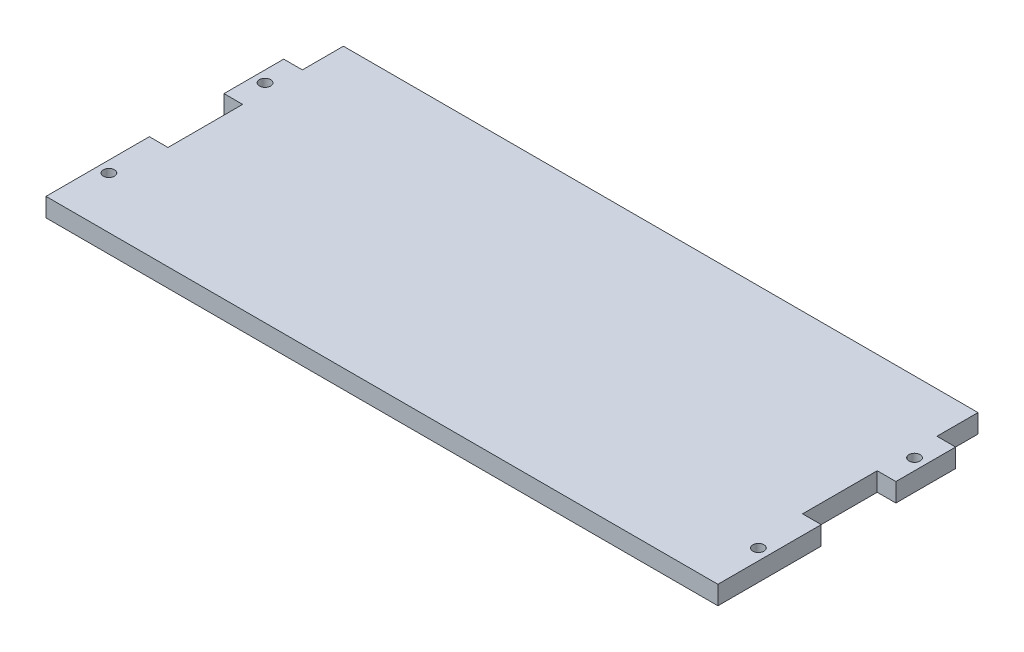
ISO-10303-21;
HEADER;
FILE_DESCRIPTION(('STEP AP214'),'2;1');
FILE_NAME('part.step','',(''),(''),'','','');
FILE_SCHEMA(('AUTOMOTIVE_DESIGN { 1 0 10303 214 1 1 1 1 }'));
ENDSEC;
DATA;
#1=APPLICATION_CONTEXT('core data for automotive mechanical design processes');
#2=APPLICATION_PROTOCOL_DEFINITION('international standard','automotive_design',2000,#1);
#3=PRODUCT_CONTEXT('',#1,'mechanical');
#4=PRODUCT('Part','Part','',(#3));
#5=PRODUCT_RELATED_PRODUCT_CATEGORY('part','',(#4));
#6=PRODUCT_DEFINITION_FORMATION('','',#4);
#7=PRODUCT_DEFINITION_CONTEXT('part definition',#1,'design');
#8=PRODUCT_DEFINITION('design','',#6,#7);
#9=PRODUCT_DEFINITION_SHAPE('','',#8);
#10=(LENGTH_UNIT() NAMED_UNIT(*) SI_UNIT(.MILLI.,.METRE.));
#11=(NAMED_UNIT(*) PLANE_ANGLE_UNIT() SI_UNIT($,.RADIAN.));
#12=(NAMED_UNIT(*) SI_UNIT($,.STERADIAN.) SOLID_ANGLE_UNIT());
#13=UNCERTAINTY_MEASURE_WITH_UNIT(LENGTH_MEASURE(1.E-05),#10,'distance_accuracy_value','');
#14=(GEOMETRIC_REPRESENTATION_CONTEXT(3) GLOBAL_UNCERTAINTY_ASSIGNED_CONTEXT((#13)) GLOBAL_UNIT_ASSIGNED_CONTEXT((#10,
#11,#12)) REPRESENTATION_CONTEXT('',''));
#15=CARTESIAN_POINT('',(0.,0.,0.));
#16=DIRECTION('',(0.,0.,1.));
#17=DIRECTION('',(1.,0.,0.));
#18=AXIS2_PLACEMENT_3D('',#15,#16,#17);
#19=CARTESIAN_POINT('',(0.,5.,-8.));
#20=DIRECTION('',(0.,0.,1.));
#21=DIRECTION('',(1.,0.,0.));
#22=AXIS2_PLACEMENT_3D('',#19,#20,#21);
#23=PLANE('',#22);
#24=DIRECTION('',(0.,1.,0.));
#25=VECTOR('',#24,1.);
#26=CARTESIAN_POINT('',(-85.,0.,-8.00000000000001));
#27=LINE('',#26,#25);
#28=CARTESIAN_POINT('',(-85.,0.,-8.00000000000001));
#29=VERTEX_POINT('',#28);
#30=CARTESIAN_POINT('',(-85.,5.,-8.00000000000001));
#31=VERTEX_POINT('',#30);
#32=EDGE_CURVE('E176',#29,#31,#27,.T.);
#33=ORIENTED_EDGE('',*,*,#32,.F.);
#34=DIRECTION('',(-1.,0.,0.));
#35=VECTOR('',#34,1.);
#36=CARTESIAN_POINT('',(0.,0.,-8.));
#37=LINE('',#36,#35);
#38=CARTESIAN_POINT('',(-90.,0.,-7.99999999999999));
#39=VERTEX_POINT('',#38);
#40=EDGE_CURVE('E173',#29,#39,#37,.T.);
#41=ORIENTED_EDGE('',*,*,#40,.T.);
#42=DIRECTION('',(0.,-1.,0.));
#43=VECTOR('',#42,1.);
#44=CARTESIAN_POINT('',(-90.,5.,-7.99999999999999));
#45=LINE('',#44,#43);
#46=CARTESIAN_POINT('',(-90.,5.,-7.99999999999999));
#47=VERTEX_POINT('',#46);
#48=EDGE_CURVE('E274',#47,#39,#45,.T.);
#49=ORIENTED_EDGE('',*,*,#48,.F.);
#50=DIRECTION('',(-1.,0.,0.));
#51=VECTOR('',#50,1.);
#52=CARTESIAN_POINT('',(0.,5.,-8.));
#53=LINE('',#52,#51);
#54=EDGE_CURVE('E230',#31,#47,#53,.T.);
#55=ORIENTED_EDGE('',*,*,#54,.F.);
#56=EDGE_LOOP('',(#33,#41,#49,#55));
#57=FACE_BOUND('',#56,.T.);
#58=ADVANCED_FACE('F42',(#57),#23,.F.);
#59=CARTESIAN_POINT('',(-90.,5.,0.));
#60=DIRECTION('',(-1.,0.,0.));
#61=DIRECTION('',(0.,0.,1.));
#62=AXIS2_PLACEMENT_3D('',#59,#60,#61);
#63=PLANE('',#62);
#64=DIRECTION('',(0.,0.,-1.));
#65=VECTOR('',#64,1.);
#66=CARTESIAN_POINT('',(-90.,0.,0.));
#67=LINE('',#66,#65);
#68=CARTESIAN_POINT('',(-90.,0.,55.68));
#69=VERTEX_POINT('',#68);
#70=CARTESIAN_POINT('',(-90.,0.,28.));
#71=VERTEX_POINT('',#70);
#72=EDGE_CURVE('E201',#69,#71,#67,.T.);
#73=ORIENTED_EDGE('',*,*,#72,.F.);
#74=DIRECTION('',(0.,-1.,0.));
#75=VECTOR('',#74,1.);
#76=CARTESIAN_POINT('',(-90.,5.,55.68));
#77=LINE('',#76,#75);
#78=CARTESIAN_POINT('',(-90.,5.,55.68));
#79=VERTEX_POINT('',#78);
#80=EDGE_CURVE('E11',#79,#69,#77,.T.);
#81=ORIENTED_EDGE('',*,*,#80,.F.);
#82=DIRECTION('',(0.,0.,-1.));
#83=VECTOR('',#82,1.);
#84=CARTESIAN_POINT('',(-90.,5.,0.));
#85=LINE('',#84,#83);
#86=CARTESIAN_POINT('',(-90.,5.,28.));
#87=VERTEX_POINT('',#86);
#88=EDGE_CURVE('E210',#79,#87,#85,.T.);
#89=ORIENTED_EDGE('',*,*,#88,.T.);
#90=DIRECTION('',(0.,-1.,0.));
#91=VECTOR('',#90,1.);
#92=CARTESIAN_POINT('',(-90.,5.,28.));
#93=LINE('',#92,#91);
#94=EDGE_CURVE('E266',#87,#71,#93,.T.);
#95=ORIENTED_EDGE('',*,*,#94,.T.);
#96=EDGE_LOOP('',(#73,#81,#89,#95));
#97=FACE_BOUND('',#96,.T.);
#98=ADVANCED_FACE('F44',(#97),#63,.T.);
#99=CARTESIAN_POINT('',(0.,5.,55.68));
#100=DIRECTION('',(0.,0.,1.));
#101=DIRECTION('',(1.,0.,0.));
#102=AXIS2_PLACEMENT_3D('',#99,#100,#101);
#103=PLANE('',#102);
#104=DIRECTION('',(-1.,0.,0.));
#105=VECTOR('',#104,1.);
#106=CARTESIAN_POINT('',(0.,0.,55.68));
#107=LINE('',#106,#105);
#108=CARTESIAN_POINT('',(90.,0.,55.68));
#109=VERTEX_POINT('',#108);
#110=EDGE_CURVE('E242',#109,#69,#107,.T.);
#111=ORIENTED_EDGE('',*,*,#110,.F.);
#112=DIRECTION('',(0.,-1.,0.));
#113=VECTOR('',#112,1.);
#114=CARTESIAN_POINT('',(90.,5.,55.68));
#115=LINE('',#114,#113);
#116=CARTESIAN_POINT('',(90.,5.,55.68));
#117=VERTEX_POINT('',#116);
#118=EDGE_CURVE('E50',#117,#109,#115,.T.);
#119=ORIENTED_EDGE('',*,*,#118,.F.);
#120=DIRECTION('',(-1.,0.,0.));
#121=VECTOR('',#120,1.);
#122=CARTESIAN_POINT('',(0.,5.,55.68));
#123=LINE('',#122,#121);
#124=EDGE_CURVE('E213',#117,#79,#123,.T.);
#125=ORIENTED_EDGE('',*,*,#124,.T.);
#126=ORIENTED_EDGE('',*,*,#80,.T.);
#127=EDGE_LOOP('',(#111,#119,#125,#126));
#128=FACE_BOUND('',#127,.T.);
#129=ADVANCED_FACE('F299',(#128),#103,.T.);
#130=CARTESIAN_POINT('',(90.,5.,0.));
#131=DIRECTION('',(-1.,0.,0.));
#132=DIRECTION('',(0.,0.,1.));
#133=AXIS2_PLACEMENT_3D('',#130,#131,#132);
#134=PLANE('',#133);
#135=DIRECTION('',(0.,0.,-1.));
#136=VECTOR('',#135,1.);
#137=CARTESIAN_POINT('',(90.,0.,0.));
#138=LINE('',#137,#136);
#139=CARTESIAN_POINT('',(90.,0.,28.));
#140=VERTEX_POINT('',#139);
#141=EDGE_CURVE('E245',#109,#140,#138,.T.);
#142=ORIENTED_EDGE('',*,*,#141,.T.);
#143=DIRECTION('',(0.,-1.,0.));
#144=VECTOR('',#143,1.);
#145=CARTESIAN_POINT('',(90.,5.,28.));
#146=LINE('',#145,#144);
#147=CARTESIAN_POINT('',(90.,5.,28.));
#148=VERTEX_POINT('',#147);
#149=EDGE_CURVE('E287',#148,#140,#146,.T.);
#150=ORIENTED_EDGE('',*,*,#149,.F.);
#151=DIRECTION('',(0.,0.,-1.));
#152=VECTOR('',#151,1.);
#153=CARTESIAN_POINT('',(90.,5.,0.));
#154=LINE('',#153,#152);
#155=EDGE_CURVE('E217',#117,#148,#154,.T.);
#156=ORIENTED_EDGE('',*,*,#155,.F.);
#157=ORIENTED_EDGE('',*,*,#118,.T.);
#158=EDGE_LOOP('',(#142,#150,#156,#157));
#159=FACE_BOUND('',#158,.T.);
#160=ADVANCED_FACE('F292',(#159),#134,.F.);
#161=CARTESIAN_POINT('',(0.,5.,28.));
#162=DIRECTION('',(0.,0.,1.));
#163=DIRECTION('',(1.,0.,0.));
#164=AXIS2_PLACEMENT_3D('',#161,#162,#163);
#165=PLANE('',#164);
#166=DIRECTION('',(-1.,0.,0.));
#167=VECTOR('',#166,1.);
#168=CARTESIAN_POINT('',(0.,0.,28.));
#169=LINE('',#168,#167);
#170=CARTESIAN_POINT('',(85.,0.,28.));
#171=VERTEX_POINT('',#170);
#172=EDGE_CURVE('E247',#140,#171,#169,.T.);
#173=ORIENTED_EDGE('',*,*,#172,.T.);
#174=DIRECTION('',(0.,-1.,0.));
#175=VECTOR('',#174,1.);
#176=CARTESIAN_POINT('',(85.,5.,28.));
#177=LINE('',#176,#175);
#178=CARTESIAN_POINT('',(85.,5.,28.));
#179=VERTEX_POINT('',#178);
#180=EDGE_CURVE('E284',#179,#171,#177,.T.);
#181=ORIENTED_EDGE('',*,*,#180,.F.);
#182=DIRECTION('',(-1.,0.,0.));
#183=VECTOR('',#182,1.);
#184=CARTESIAN_POINT('',(0.,5.,28.));
#185=LINE('',#184,#183);
#186=EDGE_CURVE('E219',#148,#179,#185,.T.);
#187=ORIENTED_EDGE('',*,*,#186,.F.);
#188=ORIENTED_EDGE('',*,*,#149,.T.);
#189=EDGE_LOOP('',(#173,#181,#187,#188));
#190=FACE_BOUND('',#189,.T.);
#191=ADVANCED_FACE('F350',(#190),#165,.F.);
#192=CARTESIAN_POINT('',(85.,5.,0.));
#193=DIRECTION('',(-1.,0.,0.));
#194=DIRECTION('',(0.,0.,1.));
#195=AXIS2_PLACEMENT_3D('',#192,#193,#194);
#196=PLANE('',#195);
#197=DIRECTION('',(0.,0.,-1.));
#198=VECTOR('',#197,1.);
#199=CARTESIAN_POINT('',(85.,0.,0.));
#200=LINE('',#199,#198);
#201=CARTESIAN_POINT('',(85.,0.,7.99999999999999));
#202=VERTEX_POINT('',#201);
#203=EDGE_CURVE('E249',#171,#202,#200,.T.);
#204=ORIENTED_EDGE('',*,*,#203,.T.);
#205=DIRECTION('',(0.,-1.,0.));
#206=VECTOR('',#205,1.);
#207=CARTESIAN_POINT('',(85.,5.,7.99999999999999));
#208=LINE('',#207,#206);
#209=CARTESIAN_POINT('',(85.,5.,7.99999999999999));
#210=VERTEX_POINT('',#209);
#211=EDGE_CURVE('E282',#210,#202,#208,.T.);
#212=ORIENTED_EDGE('',*,*,#211,.F.);
#213=DIRECTION('',(0.,0.,-1.));
#214=VECTOR('',#213,1.);
#215=CARTESIAN_POINT('',(85.,5.,0.));
#216=LINE('',#215,#214);
#217=EDGE_CURVE('E221',#179,#210,#216,.T.);
#218=ORIENTED_EDGE('',*,*,#217,.F.);
#219=ORIENTED_EDGE('',*,*,#180,.T.);
#220=EDGE_LOOP('',(#204,#212,#218,#219));
#221=FACE_BOUND('',#220,.T.);
#222=ADVANCED_FACE('F346',(#221),#196,.F.);
#223=CARTESIAN_POINT('',(0.,5.,8.));
#224=DIRECTION('',(0.,0.,1.));
#225=DIRECTION('',(1.,0.,0.));
#226=AXIS2_PLACEMENT_3D('',#223,#224,#225);
#227=PLANE('',#226);
#228=DIRECTION('',(-1.,0.,0.));
#229=VECTOR('',#228,1.);
#230=CARTESIAN_POINT('',(0.,0.,8.));
#231=LINE('',#230,#229);
#232=CARTESIAN_POINT('',(90.,0.,7.99999999999999));
#233=VERTEX_POINT('',#232);
#234=EDGE_CURVE('E252',#233,#202,#231,.T.);
#235=ORIENTED_EDGE('',*,*,#234,.F.);
#236=DIRECTION('',(0.,-1.,0.));
#237=VECTOR('',#236,1.);
#238=CARTESIAN_POINT('',(90.,5.,7.99999999999999));
#239=LINE('',#238,#237);
#240=CARTESIAN_POINT('',(90.,5.,7.99999999999999));
#241=VERTEX_POINT('',#240);
#242=EDGE_CURVE('E280',#241,#233,#239,.T.);
#243=ORIENTED_EDGE('',*,*,#242,.F.);
#244=DIRECTION('',(-1.,0.,0.));
#245=VECTOR('',#244,1.);
#246=CARTESIAN_POINT('',(0.,5.,8.));
#247=LINE('',#246,#245);
#248=EDGE_CURVE('E224',#241,#210,#247,.T.);
#249=ORIENTED_EDGE('',*,*,#248,.T.);
#250=ORIENTED_EDGE('',*,*,#211,.T.);
#251=EDGE_LOOP('',(#235,#243,#249,#250));
#252=FACE_BOUND('',#251,.T.);
#253=ADVANCED_FACE('F342',(#252),#227,.T.);
#254=CARTESIAN_POINT('',(90.,5.,0.));
#255=DIRECTION('',(-1.,0.,0.));
#256=DIRECTION('',(0.,0.,1.));
#257=AXIS2_PLACEMENT_3D('',#254,#255,#256);
#258=PLANE('',#257);
#259=DIRECTION('',(0.,0.,-1.));
#260=VECTOR('',#259,1.);
#261=CARTESIAN_POINT('',(90.,0.,0.));
#262=LINE('',#261,#260);
#263=CARTESIAN_POINT('',(90.,0.,-8.00000000000001));
#264=VERTEX_POINT('',#263);
#265=EDGE_CURVE('E255',#233,#264,#262,.T.);
#266=ORIENTED_EDGE('',*,*,#265,.T.);
#267=DIRECTION('',(0.,-1.,0.));
#268=VECTOR('',#267,1.);
#269=CARTESIAN_POINT('',(90.,5.,-8.00000000000001));
#270=LINE('',#269,#268);
#271=CARTESIAN_POINT('',(90.,5.,-8.00000000000001));
#272=VERTEX_POINT('',#271);
#273=EDGE_CURVE('E277',#272,#264,#270,.T.);
#274=ORIENTED_EDGE('',*,*,#273,.F.);
#275=DIRECTION('',(0.,0.,-1.));
#276=VECTOR('',#275,1.);
#277=CARTESIAN_POINT('',(90.,5.,0.));
#278=LINE('',#277,#276);
#279=EDGE_CURVE('E227',#241,#272,#278,.T.);
#280=ORIENTED_EDGE('',*,*,#279,.F.);
#281=ORIENTED_EDGE('',*,*,#242,.T.);
#282=EDGE_LOOP('',(#266,#274,#280,#281));
#283=FACE_BOUND('',#282,.T.);
#284=ADVANCED_FACE('F338',(#283),#258,.F.);
#285=CARTESIAN_POINT('',(85.,0.,-8.00000000000001));
#286=VERTEX_POINT('',#285);
#287=EDGE_CURVE('E258',#264,#286,#37,.T.);
#288=ORIENTED_EDGE('',*,*,#287,.T.);
#289=DIRECTION('',(0.,1.,0.));
#290=VECTOR('',#289,1.);
#291=CARTESIAN_POINT('',(85.,0.,-8.00000000000001));
#292=LINE('',#291,#290);
#293=CARTESIAN_POINT('',(85.,5.,-8.00000000000001));
#294=VERTEX_POINT('',#293);
#295=EDGE_CURVE('E182',#286,#294,#292,.T.);
#296=ORIENTED_EDGE('',*,*,#295,.T.);
#297=EDGE_CURVE('E231',#272,#294,#53,.T.);
#298=ORIENTED_EDGE('',*,*,#297,.F.);
#299=ORIENTED_EDGE('',*,*,#273,.T.);
#300=EDGE_LOOP('',(#288,#296,#298,#299));
#301=FACE_BOUND('',#300,.T.);
#302=ADVANCED_FACE('F333',(#301),#23,.F.);
#303=CARTESIAN_POINT('',(-90.,5.,0.));
#304=DIRECTION('',(-1.,0.,0.));
#305=DIRECTION('',(0.,0.,1.));
#306=AXIS2_PLACEMENT_3D('',#303,#304,#305);
#307=PLANE('',#306);
#308=DIRECTION('',(0.,0.,-1.));
#309=VECTOR('',#308,1.);
#310=CARTESIAN_POINT('',(-90.,0.,0.));
#311=LINE('',#310,#309);
#312=CARTESIAN_POINT('',(-90.,0.,8.00000000000001));
#313=VERTEX_POINT('',#312);
#314=EDGE_CURVE('E261',#313,#39,#311,.T.);
#315=ORIENTED_EDGE('',*,*,#314,.F.);
#316=DIRECTION('',(0.,-1.,0.));
#317=VECTOR('',#316,1.);
#318=CARTESIAN_POINT('',(-90.,5.,8.00000000000001));
#319=LINE('',#318,#317);
#320=CARTESIAN_POINT('',(-90.,5.,8.00000000000001));
#321=VERTEX_POINT('',#320);
#322=EDGE_CURVE('E272',#321,#313,#319,.T.);
#323=ORIENTED_EDGE('',*,*,#322,.F.);
#324=DIRECTION('',(0.,0.,-1.));
#325=VECTOR('',#324,1.);
#326=CARTESIAN_POINT('',(-90.,5.,0.));
#327=LINE('',#326,#325);
#328=EDGE_CURVE('E234',#321,#47,#327,.T.);
#329=ORIENTED_EDGE('',*,*,#328,.T.);
#330=ORIENTED_EDGE('',*,*,#48,.T.);
#331=EDGE_LOOP('',(#315,#323,#329,#330));
#332=FACE_BOUND('',#331,.T.);
#333=ADVANCED_FACE('F320',(#332),#307,.T.);
#334=CARTESIAN_POINT('',(-85.,0.,8.00000000000001));
#335=VERTEX_POINT('',#334);
#336=EDGE_CURVE('E256',#335,#313,#231,.T.);
#337=ORIENTED_EDGE('',*,*,#336,.F.);
#338=DIRECTION('',(0.,-1.,0.));
#339=VECTOR('',#338,1.);
#340=CARTESIAN_POINT('',(-85.,5.,8.00000000000001));
#341=LINE('',#340,#339);
#342=CARTESIAN_POINT('',(-85.,5.,8.00000000000001));
#343=VERTEX_POINT('',#342);
#344=EDGE_CURVE('E270',#343,#335,#341,.T.);
#345=ORIENTED_EDGE('',*,*,#344,.F.);
#346=EDGE_CURVE('E228',#343,#321,#247,.T.);
#347=ORIENTED_EDGE('',*,*,#346,.T.);
#348=ORIENTED_EDGE('',*,*,#322,.T.);
#349=EDGE_LOOP('',(#337,#345,#347,#348));
#350=FACE_BOUND('',#349,.T.);
#351=ADVANCED_FACE('F317',(#350),#227,.T.);
#352=CARTESIAN_POINT('',(-85.,5.,0.));
#353=DIRECTION('',(-1.,0.,0.));
#354=DIRECTION('',(0.,0.,1.));
#355=AXIS2_PLACEMENT_3D('',#352,#353,#354);
#356=PLANE('',#355);
#357=DIRECTION('',(0.,0.,-1.));
#358=VECTOR('',#357,1.);
#359=CARTESIAN_POINT('',(-85.,0.,0.));
#360=LINE('',#359,#358);
#361=CARTESIAN_POINT('',(-85.,0.,28.));
#362=VERTEX_POINT('',#361);
#363=EDGE_CURVE('E263',#362,#335,#360,.T.);
#364=ORIENTED_EDGE('',*,*,#363,.F.);
#365=DIRECTION('',(0.,-1.,0.));
#366=VECTOR('',#365,1.);
#367=CARTESIAN_POINT('',(-85.,5.,28.));
#368=LINE('',#367,#366);
#369=CARTESIAN_POINT('',(-85.,5.,28.));
#370=VERTEX_POINT('',#369);
#371=EDGE_CURVE('E268',#370,#362,#368,.T.);
#372=ORIENTED_EDGE('',*,*,#371,.F.);
#373=DIRECTION('',(0.,0.,-1.));
#374=VECTOR('',#373,1.);
#375=CARTESIAN_POINT('',(-85.,5.,0.));
#376=LINE('',#375,#374);
#377=EDGE_CURVE('E237',#370,#343,#376,.T.);
#378=ORIENTED_EDGE('',*,*,#377,.T.);
#379=ORIENTED_EDGE('',*,*,#344,.T.);
#380=EDGE_LOOP('',(#364,#372,#378,#379));
#381=FACE_BOUND('',#380,.T.);
#382=ADVANCED_FACE('F310',(#381),#356,.T.);
#383=EDGE_CURVE('E214',#362,#71,#169,.T.);
#384=ORIENTED_EDGE('',*,*,#383,.T.);
#385=ORIENTED_EDGE('',*,*,#94,.F.);
#386=EDGE_CURVE('E222',#370,#87,#185,.T.);
#387=ORIENTED_EDGE('',*,*,#386,.F.);
#388=ORIENTED_EDGE('',*,*,#371,.T.);
#389=EDGE_LOOP('',(#384,#385,#387,#388));
#390=FACE_BOUND('',#389,.T.);
#391=ADVANCED_FACE('F351',(#390),#165,.F.);
#392=CARTESIAN_POINT('',(0.,5.,0.));
#393=DIRECTION('',(0.,1.,0.));
#394=DIRECTION('',(0.,0.,1.));
#395=AXIS2_PLACEMENT_3D('',#392,#393,#394);
#396=PLANE('',#395);
#397=DIRECTION('',(1.,0.,0.));
#398=VECTOR('',#397,1.);
#399=CARTESIAN_POINT('',(-85.,5.,-19.));
#400=LINE('',#399,#398);
#401=CARTESIAN_POINT('',(-85.,5.,-19.));
#402=VERTEX_POINT('',#401);
#403=CARTESIAN_POINT('',(85.,5.,-19.));
#404=VERTEX_POINT('',#403);
#405=EDGE_CURVE('E57',#402,#404,#400,.T.);
#406=ORIENTED_EDGE('',*,*,#405,.F.);
#407=DIRECTION('',(0.,0.,1.));
#408=VECTOR('',#407,1.);
#409=CARTESIAN_POINT('',(-85.,5.,-23.));
#410=LINE('',#409,#408);
#411=EDGE_CURVE('E168',#402,#31,#410,.T.);
#412=ORIENTED_EDGE('',*,*,#411,.T.);
#413=ORIENTED_EDGE('',*,*,#54,.T.);
#414=ORIENTED_EDGE('',*,*,#328,.F.);
#415=ORIENTED_EDGE('',*,*,#346,.F.);
#416=ORIENTED_EDGE('',*,*,#377,.F.);
#417=ORIENTED_EDGE('',*,*,#386,.T.);
#418=ORIENTED_EDGE('',*,*,#88,.F.);
#419=ORIENTED_EDGE('',*,*,#124,.F.);
#420=ORIENTED_EDGE('',*,*,#155,.T.);
#421=ORIENTED_EDGE('',*,*,#186,.T.);
#422=ORIENTED_EDGE('',*,*,#217,.T.);
#423=ORIENTED_EDGE('',*,*,#248,.F.);
#424=ORIENTED_EDGE('',*,*,#279,.T.);
#425=ORIENTED_EDGE('',*,*,#297,.T.);
#426=DIRECTION('',(0.,0.,-1.));
#427=VECTOR('',#426,1.);
#428=CARTESIAN_POINT('',(85.,5.,-23.));
#429=LINE('',#428,#427);
#430=EDGE_CURVE('E64',#294,#404,#429,.T.);
#431=ORIENTED_EDGE('',*,*,#430,.T.);
#432=EDGE_LOOP('',(#406,#412,#413,#414,#415,#416,#417,#418,#419,#420,#421,#422,#423,#424,#425,#431));
#433=FACE_BOUND('',#432,.T.);
#434=CARTESIAN_POINT('',(87.,5.,0.));
#435=DIRECTION('',(0.,-1.,0.));
#436=DIRECTION('',(0.,0.,1.));
#437=AXIS2_PLACEMENT_3D('',#434,#435,#436);
#438=CIRCLE('',#437,1.5);
#439=CARTESIAN_POINT('',(87.,5.,1.50000000000001));
#440=VERTEX_POINT('',#439);
#441=EDGE_CURVE('E190',#440,#440,#438,.T.);
#442=ORIENTED_EDGE('',*,*,#441,.T.);
#443=EDGE_LOOP('',(#442));
#444=FACE_BOUND('',#443,.T.);
#445=CARTESIAN_POINT('',(87.,5.,41.84));
#446=DIRECTION('',(0.,-1.,0.));
#447=DIRECTION('',(0.,0.,1.));
#448=AXIS2_PLACEMENT_3D('',#445,#446,#447);
#449=CIRCLE('',#448,1.5);
#450=CARTESIAN_POINT('',(87.,5.,43.34));
#451=VERTEX_POINT('',#450);
#452=EDGE_CURVE('E184',#451,#451,#449,.T.);
#453=ORIENTED_EDGE('',*,*,#452,.T.);
#454=EDGE_LOOP('',(#453));
#455=FACE_BOUND('',#454,.T.);
#456=CARTESIAN_POINT('',(-87.,5.,0.));
#457=DIRECTION('',(0.,1.,0.));
#458=DIRECTION('',(0.,0.,1.));
#459=AXIS2_PLACEMENT_3D('',#456,#457,#458);
#460=CIRCLE('',#459,1.5);
#461=CARTESIAN_POINT('',(-87.,5.,1.50000000000001));
#462=VERTEX_POINT('',#461);
#463=EDGE_CURVE('E202',#462,#462,#460,.T.);
#464=ORIENTED_EDGE('',*,*,#463,.F.);
#465=EDGE_LOOP('',(#464));
#466=FACE_BOUND('',#465,.T.);
#467=CARTESIAN_POINT('',(-87.,5.,41.84));
#468=DIRECTION('',(0.,1.,0.));
#469=DIRECTION('',(0.,0.,1.));
#470=AXIS2_PLACEMENT_3D('',#467,#468,#469);
#471=CIRCLE('',#470,1.5);
#472=CARTESIAN_POINT('',(-87.,5.,43.34));
#473=VERTEX_POINT('',#472);
#474=EDGE_CURVE('E189',#473,#473,#471,.T.);
#475=ORIENTED_EDGE('',*,*,#474,.F.);
#476=EDGE_LOOP('',(#475));
#477=FACE_BOUND('',#476,.T.);
#478=ADVANCED_FACE('F326',(#433,#444,#455,#466,#477),#396,.T.);
#479=CARTESIAN_POINT('',(0.,0.,0.));
#480=DIRECTION('',(0.,1.,0.));
#481=DIRECTION('',(0.,0.,1.));
#482=AXIS2_PLACEMENT_3D('',#479,#480,#481);
#483=PLANE('',#482);
#484=CARTESIAN_POINT('',(87.,0.,0.));
#485=DIRECTION('',(0.,-1.,0.));
#486=DIRECTION('',(0.,0.,1.));
#487=AXIS2_PLACEMENT_3D('',#484,#485,#486);
#488=CIRCLE('',#487,1.5);
#489=CARTESIAN_POINT('',(87.,0.,1.50000000000001));
#490=VERTEX_POINT('',#489);
#491=EDGE_CURVE('E186',#490,#490,#488,.T.);
#492=ORIENTED_EDGE('',*,*,#491,.F.);
#493=EDGE_LOOP('',(#492));
#494=FACE_BOUND('',#493,.T.);
#495=CARTESIAN_POINT('',(87.,0.,41.84));
#496=DIRECTION('',(0.,-1.,0.));
#497=DIRECTION('',(0.,0.,1.));
#498=AXIS2_PLACEMENT_3D('',#495,#496,#497);
#499=CIRCLE('',#498,1.5);
#500=CARTESIAN_POINT('',(87.,0.,43.34));
#501=VERTEX_POINT('',#500);
#502=EDGE_CURVE('E193',#501,#501,#499,.T.);
#503=ORIENTED_EDGE('',*,*,#502,.F.);
#504=EDGE_LOOP('',(#503));
#505=FACE_BOUND('',#504,.T.);
#506=CARTESIAN_POINT('',(-87.,0.,0.));
#507=DIRECTION('',(0.,1.,0.));
#508=DIRECTION('',(0.,0.,1.));
#509=AXIS2_PLACEMENT_3D('',#506,#507,#508);
#510=CIRCLE('',#509,1.5);
#511=CARTESIAN_POINT('',(-87.,0.,1.50000000000001));
#512=VERTEX_POINT('',#511);
#513=EDGE_CURVE('E198',#512,#512,#510,.T.);
#514=ORIENTED_EDGE('',*,*,#513,.T.);
#515=EDGE_LOOP('',(#514));
#516=FACE_BOUND('',#515,.T.);
#517=CARTESIAN_POINT('',(-87.,0.,41.84));
#518=DIRECTION('',(0.,1.,0.));
#519=DIRECTION('',(0.,0.,1.));
#520=AXIS2_PLACEMENT_3D('',#517,#518,#519);
#521=CIRCLE('',#520,1.5);
#522=CARTESIAN_POINT('',(-87.,0.,43.34));
#523=VERTEX_POINT('',#522);
#524=EDGE_CURVE('E205',#523,#523,#521,.T.);
#525=ORIENTED_EDGE('',*,*,#524,.T.);
#526=EDGE_LOOP('',(#525));
#527=FACE_BOUND('',#526,.T.);
#528=DIRECTION('',(0.,0.,1.));
#529=VECTOR('',#528,1.);
#530=CARTESIAN_POINT('',(-85.,0.,-23.));
#531=LINE('',#530,#529);
#532=CARTESIAN_POINT('',(-85.,0.,-19.));
#533=VERTEX_POINT('',#532);
#534=EDGE_CURVE('E166',#533,#29,#531,.T.);
#535=ORIENTED_EDGE('',*,*,#534,.F.);
#536=DIRECTION('',(1.,0.,0.));
#537=VECTOR('',#536,1.);
#538=CARTESIAN_POINT('',(-85.,0.,-19.));
#539=LINE('',#538,#537);
#540=CARTESIAN_POINT('',(85.,0.,-19.));
#541=VERTEX_POINT('',#540);
#542=EDGE_CURVE('E152',#533,#541,#539,.T.);
#543=ORIENTED_EDGE('',*,*,#542,.T.);
#544=DIRECTION('',(0.,0.,-1.));
#545=VECTOR('',#544,1.);
#546=CARTESIAN_POINT('',(85.,0.,-23.));
#547=LINE('',#546,#545);
#548=EDGE_CURVE('E174',#286,#541,#547,.T.);
#549=ORIENTED_EDGE('',*,*,#548,.F.);
#550=ORIENTED_EDGE('',*,*,#287,.F.);
#551=ORIENTED_EDGE('',*,*,#265,.F.);
#552=ORIENTED_EDGE('',*,*,#234,.T.);
#553=ORIENTED_EDGE('',*,*,#203,.F.);
#554=ORIENTED_EDGE('',*,*,#172,.F.);
#555=ORIENTED_EDGE('',*,*,#141,.F.);
#556=ORIENTED_EDGE('',*,*,#110,.T.);
#557=ORIENTED_EDGE('',*,*,#72,.T.);
#558=ORIENTED_EDGE('',*,*,#383,.F.);
#559=ORIENTED_EDGE('',*,*,#363,.T.);
#560=ORIENTED_EDGE('',*,*,#336,.T.);
#561=ORIENTED_EDGE('',*,*,#314,.T.);
#562=ORIENTED_EDGE('',*,*,#40,.F.);
#563=EDGE_LOOP('',(#535,#543,#549,#550,#551,#552,#553,#554,#555,#556,#557,#558,#559,#560,#561,#562));
#564=FACE_BOUND('',#563,.T.);
#565=ADVANCED_FACE('F171',(#494,#505,#516,#527,#564),#483,.F.);
#566=CARTESIAN_POINT('',(-87.,0.,41.84));
#567=DIRECTION('',(0.,1.,0.));
#568=DIRECTION('',(0.,0.,1.));
#569=AXIS2_PLACEMENT_3D('',#566,#567,#568);
#570=CYLINDRICAL_SURFACE('',#569,1.5);
#571=ORIENTED_EDGE('',*,*,#524,.F.);
#572=EDGE_LOOP('',(#571));
#573=FACE_BOUND('',#572,.T.);
#574=ORIENTED_EDGE('',*,*,#474,.T.);
#575=EDGE_LOOP('',(#574));
#576=FACE_BOUND('',#575,.T.);
#577=ADVANCED_FACE('F440',(#573,#576),#570,.F.);
#578=CARTESIAN_POINT('',(-87.,0.,0.));
#579=DIRECTION('',(0.,1.,0.));
#580=DIRECTION('',(0.,0.,1.));
#581=AXIS2_PLACEMENT_3D('',#578,#579,#580);
#582=CYLINDRICAL_SURFACE('',#581,1.5);
#583=ORIENTED_EDGE('',*,*,#513,.F.);
#584=EDGE_LOOP('',(#583));
#585=FACE_BOUND('',#584,.T.);
#586=ORIENTED_EDGE('',*,*,#463,.T.);
#587=EDGE_LOOP('',(#586));
#588=FACE_BOUND('',#587,.T.);
#589=ADVANCED_FACE('F445',(#585,#588),#582,.F.);
#590=CARTESIAN_POINT('',(87.,0.,41.84));
#591=DIRECTION('',(0.,1.,0.));
#592=DIRECTION('',(0.,0.,1.));
#593=AXIS2_PLACEMENT_3D('',#590,#591,#592);
#594=CYLINDRICAL_SURFACE('',#593,1.5);
#595=ORIENTED_EDGE('',*,*,#502,.T.);
#596=EDGE_LOOP('',(#595));
#597=FACE_BOUND('',#596,.T.);
#598=ORIENTED_EDGE('',*,*,#452,.F.);
#599=EDGE_LOOP('',(#598));
#600=FACE_BOUND('',#599,.T.);
#601=ADVANCED_FACE('F457',(#597,#600),#594,.F.);
#602=CARTESIAN_POINT('',(87.,0.,0.));
#603=DIRECTION('',(0.,1.,0.));
#604=DIRECTION('',(0.,0.,1.));
#605=AXIS2_PLACEMENT_3D('',#602,#603,#604);
#606=CYLINDRICAL_SURFACE('',#605,1.5);
#607=ORIENTED_EDGE('',*,*,#491,.T.);
#608=EDGE_LOOP('',(#607));
#609=FACE_BOUND('',#608,.T.);
#610=ORIENTED_EDGE('',*,*,#441,.F.);
#611=EDGE_LOOP('',(#610));
#612=FACE_BOUND('',#611,.T.);
#613=ADVANCED_FACE('F467',(#609,#612),#606,.F.);
#614=CARTESIAN_POINT('',(-85.,0.,-23.));
#615=DIRECTION('',(-1.,0.,0.));
#616=DIRECTION('',(0.,0.,1.));
#617=AXIS2_PLACEMENT_3D('',#614,#615,#616);
#618=PLANE('',#617);
#619=DIRECTION('',(0.,1.,0.));
#620=VECTOR('',#619,1.);
#621=CARTESIAN_POINT('',(-85.,0.,-19.));
#622=LINE('',#621,#620);
#623=EDGE_CURVE('E155',#533,#402,#622,.T.);
#624=ORIENTED_EDGE('',*,*,#623,.F.);
#625=ORIENTED_EDGE('',*,*,#534,.T.);
#626=ORIENTED_EDGE('',*,*,#32,.T.);
#627=ORIENTED_EDGE('',*,*,#411,.F.);
#628=EDGE_LOOP('',(#624,#625,#626,#627));
#629=FACE_BOUND('',#628,.T.);
#630=ADVANCED_FACE('F164',(#629),#618,.T.);
#631=CARTESIAN_POINT('',(85.,0.,-23.));
#632=DIRECTION('',(1.,0.,0.));
#633=DIRECTION('',(0.,0.,-1.));
#634=AXIS2_PLACEMENT_3D('',#631,#632,#633);
#635=PLANE('',#634);
#636=DIRECTION('',(0.,1.,0.));
#637=VECTOR('',#636,1.);
#638=CARTESIAN_POINT('',(85.,0.,-19.));
#639=LINE('',#638,#637);
#640=EDGE_CURVE('E156',#541,#404,#639,.T.);
#641=ORIENTED_EDGE('',*,*,#640,.T.);
#642=ORIENTED_EDGE('',*,*,#430,.F.);
#643=ORIENTED_EDGE('',*,*,#295,.F.);
#644=ORIENTED_EDGE('',*,*,#548,.T.);
#645=EDGE_LOOP('',(#641,#642,#643,#644));
#646=FACE_BOUND('',#645,.T.);
#647=ADVANCED_FACE('F329',(#646),#635,.T.);
#648=CARTESIAN_POINT('',(-85.,0.,-19.));
#649=DIRECTION('',(0.,0.,1.));
#650=DIRECTION('',(1.,0.,0.));
#651=AXIS2_PLACEMENT_3D('',#648,#649,#650);
#652=PLANE('',#651);
#653=ORIENTED_EDGE('',*,*,#405,.T.);
#654=ORIENTED_EDGE('',*,*,#640,.F.);
#655=ORIENTED_EDGE('',*,*,#542,.F.);
#656=ORIENTED_EDGE('',*,*,#623,.T.);
#657=EDGE_LOOP('',(#653,#654,#655,#656));
#658=FACE_BOUND('',#657,.T.);
#659=ADVANCED_FACE('F154',(#658),#652,.F.);
#660=CLOSED_SHELL('',(#58,#98,#129,#160,#191,#222,#253,#284,#302,#333,#351,#382,#391,#478,#565,
#577,#589,#601,#613,#630,#647,#659));
#661=MANIFOLD_SOLID_BREP('B2',#660);
#662=ADVANCED_BREP_SHAPE_REPRESENTATION('',(#18,#661),#14);
#663=SHAPE_DEFINITION_REPRESENTATION(#9,#662);
ENDSEC;
END-ISO-10303-21;
